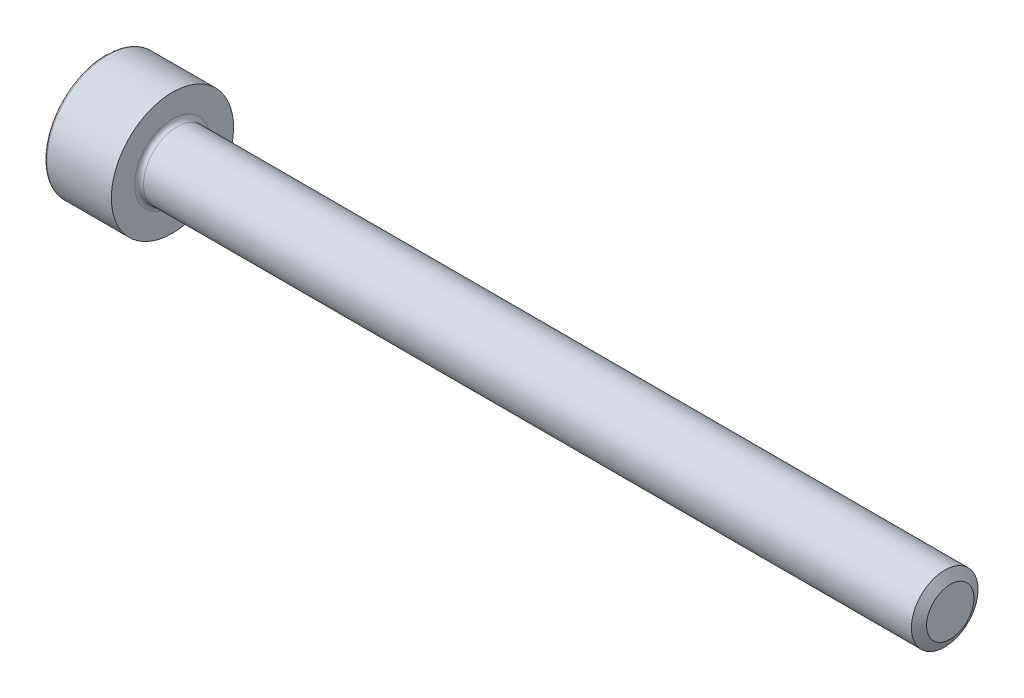
ISO-10303-21;
HEADER;
FILE_DESCRIPTION(('STEP AP214'),'2;1');
FILE_NAME('part.step','',(''),(''),'','','');
FILE_SCHEMA(('AUTOMOTIVE_DESIGN { 1 0 10303 214 1 1 1 1 }'));
ENDSEC;
DATA;
#1=APPLICATION_CONTEXT('core data for automotive mechanical design processes');
#2=APPLICATION_PROTOCOL_DEFINITION('international standard','automotive_design',2000,#1);
#3=PRODUCT_CONTEXT('',#1,'mechanical');
#4=PRODUCT('Part','Part','',(#3));
#5=PRODUCT_RELATED_PRODUCT_CATEGORY('part','',(#4));
#6=PRODUCT_DEFINITION_FORMATION('','',#4);
#7=PRODUCT_DEFINITION_CONTEXT('part definition',#1,'design');
#8=PRODUCT_DEFINITION('design','',#6,#7);
#9=PRODUCT_DEFINITION_SHAPE('','',#8);
#10=(LENGTH_UNIT() NAMED_UNIT(*) SI_UNIT(.MILLI.,.METRE.));
#11=(NAMED_UNIT(*) PLANE_ANGLE_UNIT() SI_UNIT($,.RADIAN.));
#12=(NAMED_UNIT(*) SI_UNIT($,.STERADIAN.) SOLID_ANGLE_UNIT());
#13=UNCERTAINTY_MEASURE_WITH_UNIT(LENGTH_MEASURE(1.E-05),#10,'distance_accuracy_value','');
#14=(GEOMETRIC_REPRESENTATION_CONTEXT(3) GLOBAL_UNCERTAINTY_ASSIGNED_CONTEXT((#13)) GLOBAL_UNIT_ASSIGNED_CONTEXT((#10,
#11,#12)) REPRESENTATION_CONTEXT('',''));
#15=CARTESIAN_POINT('',(0.,0.,0.));
#16=DIRECTION('',(0.,0.,1.));
#17=DIRECTION('',(1.,0.,0.));
#18=AXIS2_PLACEMENT_3D('',#15,#16,#17);
#19=CARTESIAN_POINT('',(0.,0.,0.));
#20=DIRECTION('',(-1.,0.,0.));
#21=DIRECTION('',(0.,0.,1.));
#22=AXIS2_PLACEMENT_3D('',#19,#20,#21);
#23=CYLINDRICAL_SURFACE('',#22,1.5);
#24=CARTESIAN_POINT('',(3.2,0.,0.));
#25=DIRECTION('',(-1.,0.,0.));
#26=DIRECTION('',(0.,0.,1.));
#27=AXIS2_PLACEMENT_3D('',#24,#25,#26);
#28=CIRCLE('',#27,1.5);
#29=CARTESIAN_POINT('',(3.2,0.,1.5));
#30=VERTEX_POINT('',#29);
#31=EDGE_CURVE('E150',#30,#30,#28,.T.);
#32=ORIENTED_EDGE('',*,*,#31,.F.);
#33=EDGE_LOOP('',(#32));
#34=FACE_BOUND('',#33,.T.);
#35=CARTESIAN_POINT('',(37.7500073334409,0.,0.));
#36=DIRECTION('',(-1.,0.,0.));
#37=DIRECTION('',(0.,0.,1.));
#38=AXIS2_PLACEMENT_3D('',#35,#36,#37);
#39=CIRCLE('',#38,1.5);
#40=CARTESIAN_POINT('',(37.7500073334409,0.,1.5));
#41=VERTEX_POINT('',#40);
#42=EDGE_CURVE('E287',#41,#41,#39,.T.);
#43=ORIENTED_EDGE('',*,*,#42,.T.);
#44=EDGE_LOOP('',(#43));
#45=FACE_BOUND('',#44,.T.);
#46=ADVANCED_FACE('F47',(#34,#45),#23,.T.);
#47=CARTESIAN_POINT('',(0.,0.,0.));
#48=DIRECTION('',(1.,0.,0.));
#49=DIRECTION('',(0.,0.,-1.));
#50=AXIS2_PLACEMENT_3D('',#47,#48,#49);
#51=PLANE('',#50);
#52=CARTESIAN_POINT('',(0.,0.,0.));
#53=DIRECTION('',(1.,0.,0.));
#54=DIRECTION('',(0.,0.,-1.));
#55=AXIS2_PLACEMENT_3D('',#52,#53,#54);
#56=CIRCLE('',#55,2.65);
#57=CARTESIAN_POINT('',(0.,0.,-2.65));
#58=VERTEX_POINT('',#57);
#59=EDGE_CURVE('E55',#58,#58,#56,.F.);
#60=ORIENTED_EDGE('',*,*,#59,.T.);
#61=EDGE_LOOP('',(#60));
#62=FACE_BOUND('',#61,.T.);
#63=DIRECTION('',(0.,0.866025403784439,-0.5));
#64=VECTOR('',#63,1.);
#65=CARTESIAN_POINT('',(0.,0.,1.435));
#66=LINE('',#65,#64);
#67=CARTESIAN_POINT('',(0.,0.,1.435));
#68=VERTEX_POINT('',#67);
#69=CARTESIAN_POINT('',(0.,1.24274645443067,0.717499999999999));
#70=VERTEX_POINT('',#69);
#71=EDGE_CURVE('E136',#68,#70,#66,.T.);
#72=ORIENTED_EDGE('',*,*,#71,.F.);
#73=DIRECTION('',(0.,0.866025403784439,0.5));
#74=VECTOR('',#73,1.);
#75=CARTESIAN_POINT('',(0.,-1.24274645443067,0.7175));
#76=LINE('',#75,#74);
#77=CARTESIAN_POINT('',(0.,-1.24274645443067,0.7175));
#78=VERTEX_POINT('',#77);
#79=EDGE_CURVE('E62',#78,#68,#76,.T.);
#80=ORIENTED_EDGE('',*,*,#79,.F.);
#81=DIRECTION('',(0.,0.,1.));
#82=VECTOR('',#81,1.);
#83=CARTESIAN_POINT('',(0.,-1.24274645443067,-0.7175));
#84=LINE('',#83,#82);
#85=CARTESIAN_POINT('',(0.,-1.24274645443067,-0.7175));
#86=VERTEX_POINT('',#85);
#87=EDGE_CURVE('E146',#86,#78,#84,.T.);
#88=ORIENTED_EDGE('',*,*,#87,.F.);
#89=DIRECTION('',(0.,-0.866025403784439,0.5));
#90=VECTOR('',#89,1.);
#91=CARTESIAN_POINT('',(0.,0.,-1.435));
#92=LINE('',#91,#90);
#93=CARTESIAN_POINT('',(0.,0.,-1.435));
#94=VERTEX_POINT('',#93);
#95=EDGE_CURVE('E144',#94,#86,#92,.T.);
#96=ORIENTED_EDGE('',*,*,#95,.F.);
#97=DIRECTION('',(0.,-0.866025403784439,-0.5));
#98=VECTOR('',#97,1.);
#99=CARTESIAN_POINT('',(0.,1.24274645443067,-0.7175));
#100=LINE('',#99,#98);
#101=CARTESIAN_POINT('',(0.,1.24274645443067,-0.7175));
#102=VERTEX_POINT('',#101);
#103=EDGE_CURVE('E110',#102,#94,#100,.T.);
#104=ORIENTED_EDGE('',*,*,#103,.F.);
#105=DIRECTION('',(0.,0.,-1.));
#106=VECTOR('',#105,1.);
#107=CARTESIAN_POINT('',(0.,1.24274645443067,0.717499999999999));
#108=LINE('',#107,#106);
#109=EDGE_CURVE('E140',#70,#102,#108,.T.);
#110=ORIENTED_EDGE('',*,*,#109,.F.);
#111=EDGE_LOOP('',(#72,#80,#88,#96,#104,#110));
#112=FACE_BOUND('',#111,.T.);
#113=ADVANCED_FACE('F167',(#62,#112),#51,.F.);
#114=CARTESIAN_POINT('',(0.,0.,0.));
#115=DIRECTION('',(-1.,0.,0.));
#116=DIRECTION('',(0.,0.,1.));
#117=AXIS2_PLACEMENT_3D('',#114,#115,#116);
#118=CYLINDRICAL_SURFACE('',#117,2.75);
#119=CARTESIAN_POINT('',(0.1,0.,0.));
#120=DIRECTION('',(1.,0.,0.));
#121=DIRECTION('',(0.,0.,-1.));
#122=AXIS2_PLACEMENT_3D('',#119,#120,#121);
#123=CIRCLE('',#122,2.75);
#124=CARTESIAN_POINT('',(0.1,0.,-2.75));
#125=VERTEX_POINT('',#124);
#126=EDGE_CURVE('E11',#125,#125,#123,.T.);
#127=ORIENTED_EDGE('',*,*,#126,.T.);
#128=EDGE_LOOP('',(#127));
#129=FACE_BOUND('',#128,.T.);
#130=CARTESIAN_POINT('',(3.,0.,0.));
#131=DIRECTION('',(-1.,0.,0.));
#132=DIRECTION('',(0.,0.,1.));
#133=AXIS2_PLACEMENT_3D('',#130,#131,#132);
#134=CIRCLE('',#133,2.75);
#135=CARTESIAN_POINT('',(3.,0.,2.75));
#136=VERTEX_POINT('',#135);
#137=EDGE_CURVE('E161',#136,#136,#134,.T.);
#138=ORIENTED_EDGE('',*,*,#137,.T.);
#139=EDGE_LOOP('',(#138));
#140=FACE_BOUND('',#139,.T.);
#141=ADVANCED_FACE('F186',(#129,#140),#118,.T.);
#142=CARTESIAN_POINT('',(3.,2.75,0.));
#143=DIRECTION('',(-1.,0.,0.));
#144=DIRECTION('',(0.,0.,1.));
#145=AXIS2_PLACEMENT_3D('',#142,#143,#144);
#146=PLANE('',#145);
#147=ORIENTED_EDGE('',*,*,#137,.F.);
#148=EDGE_LOOP('',(#147));
#149=FACE_BOUND('',#148,.T.);
#150=CARTESIAN_POINT('',(3.,0.,0.));
#151=DIRECTION('',(-1.,0.,0.));
#152=DIRECTION('',(0.,0.,1.));
#153=AXIS2_PLACEMENT_3D('',#150,#151,#152);
#154=CIRCLE('',#153,1.7);
#155=CARTESIAN_POINT('',(3.,0.,1.7));
#156=VERTEX_POINT('',#155);
#157=EDGE_CURVE('E158',#156,#156,#154,.T.);
#158=ORIENTED_EDGE('',*,*,#157,.T.);
#159=EDGE_LOOP('',(#158));
#160=FACE_BOUND('',#159,.T.);
#161=ADVANCED_FACE('F195',(#149,#160),#146,.F.);
#162=CARTESIAN_POINT('',(3.2,0.,0.));
#163=DIRECTION('',(-1.,0.,0.));
#164=DIRECTION('',(0.,0.,1.));
#165=AXIS2_PLACEMENT_3D('',#162,#163,#164);
#166=TOROIDAL_SURFACE('',#165,1.7,0.2);
#167=ORIENTED_EDGE('',*,*,#157,.F.);
#168=EDGE_LOOP('',(#167));
#169=FACE_BOUND('',#168,.T.);
#170=ORIENTED_EDGE('',*,*,#31,.T.);
#171=EDGE_LOOP('',(#170));
#172=FACE_BOUND('',#171,.T.);
#173=ADVANCED_FACE('F191',(#169,#172),#166,.F.);
#174=CARTESIAN_POINT('',(1.3,-1.24274645443067,0.7175));
#175=DIRECTION('',(0.,-0.5,0.866025403784439));
#176=DIRECTION('',(0.,-0.866025403784439,-0.5));
#177=AXIS2_PLACEMENT_3D('',#174,#175,#176);
#178=PLANE('',#177);
#179=ORIENTED_EDGE('',*,*,#79,.T.);
#180=DIRECTION('',(-1.,0.,0.));
#181=VECTOR('',#180,1.);
#182=CARTESIAN_POINT('',(1.3,0.,1.435));
#183=LINE('',#182,#181);
#184=CARTESIAN_POINT('',(1.3,0.,1.435));
#185=VERTEX_POINT('',#184);
#186=EDGE_CURVE('E92',#185,#68,#183,.T.);
#187=ORIENTED_EDGE('',*,*,#186,.F.);
#188=DIRECTION('',(0.,0.866025403784439,0.5));
#189=VECTOR('',#188,1.);
#190=CARTESIAN_POINT('',(1.3,-1.24274645443067,0.7175));
#191=LINE('',#190,#189);
#192=CARTESIAN_POINT('',(1.3,-1.24274645443067,0.7175));
#193=VERTEX_POINT('',#192);
#194=EDGE_CURVE('E148',#193,#185,#191,.T.);
#195=ORIENTED_EDGE('',*,*,#194,.F.);
#196=DIRECTION('',(-1.,0.,0.));
#197=VECTOR('',#196,1.);
#198=CARTESIAN_POINT('',(1.3,-1.24274645443067,0.7175));
#199=LINE('',#198,#197);
#200=EDGE_CURVE('E70',#193,#78,#199,.T.);
#201=ORIENTED_EDGE('',*,*,#200,.T.);
#202=EDGE_LOOP('',(#179,#187,#195,#201));
#203=FACE_BOUND('',#202,.T.);
#204=ADVANCED_FACE('F194',(#203),#178,.F.);
#205=CARTESIAN_POINT('',(1.3,-1.24274645443067,-0.7175));
#206=DIRECTION('',(0.,-1.,0.));
#207=DIRECTION('',(0.,0.,-1.));
#208=AXIS2_PLACEMENT_3D('',#205,#206,#207);
#209=PLANE('',#208);
#210=ORIENTED_EDGE('',*,*,#87,.T.);
#211=ORIENTED_EDGE('',*,*,#200,.F.);
#212=DIRECTION('',(0.,0.,1.));
#213=VECTOR('',#212,1.);
#214=CARTESIAN_POINT('',(1.3,-1.24274645443067,-0.7175));
#215=LINE('',#214,#213);
#216=CARTESIAN_POINT('',(1.3,-1.24274645443067,-0.7175));
#217=VERTEX_POINT('',#216);
#218=EDGE_CURVE('E122',#217,#193,#215,.T.);
#219=ORIENTED_EDGE('',*,*,#218,.F.);
#220=DIRECTION('',(-1.,0.,0.));
#221=VECTOR('',#220,1.);
#222=CARTESIAN_POINT('',(1.3,-1.24274645443067,-0.7175));
#223=LINE('',#222,#221);
#224=EDGE_CURVE('E114',#217,#86,#223,.T.);
#225=ORIENTED_EDGE('',*,*,#224,.T.);
#226=EDGE_LOOP('',(#210,#211,#219,#225));
#227=FACE_BOUND('',#226,.T.);
#228=ADVANCED_FACE('F225',(#227),#209,.F.);
#229=CARTESIAN_POINT('',(1.3,0.,-1.435));
#230=DIRECTION('',(0.,-0.5,-0.866025403784439));
#231=DIRECTION('',(0.,0.866025403784439,-0.5));
#232=AXIS2_PLACEMENT_3D('',#229,#230,#231);
#233=PLANE('',#232);
#234=ORIENTED_EDGE('',*,*,#95,.T.);
#235=ORIENTED_EDGE('',*,*,#224,.F.);
#236=DIRECTION('',(0.,-0.866025403784439,0.5));
#237=VECTOR('',#236,1.);
#238=CARTESIAN_POINT('',(1.3,0.,-1.435));
#239=LINE('',#238,#237);
#240=CARTESIAN_POINT('',(1.3,0.,-1.435));
#241=VERTEX_POINT('',#240);
#242=EDGE_CURVE('E118',#241,#217,#239,.T.);
#243=ORIENTED_EDGE('',*,*,#242,.F.);
#244=DIRECTION('',(-1.,0.,0.));
#245=VECTOR('',#244,1.);
#246=CARTESIAN_POINT('',(1.3,0.,-1.435));
#247=LINE('',#246,#245);
#248=EDGE_CURVE('E103',#241,#94,#247,.T.);
#249=ORIENTED_EDGE('',*,*,#248,.T.);
#250=EDGE_LOOP('',(#234,#235,#243,#249));
#251=FACE_BOUND('',#250,.T.);
#252=ADVANCED_FACE('F119',(#251),#233,.F.);
#253=CARTESIAN_POINT('',(1.3,1.24274645443067,-0.7175));
#254=DIRECTION('',(0.,0.5,-0.866025403784439));
#255=DIRECTION('',(0.,0.866025403784439,0.5));
#256=AXIS2_PLACEMENT_3D('',#253,#254,#255);
#257=PLANE('',#256);
#258=ORIENTED_EDGE('',*,*,#103,.T.);
#259=ORIENTED_EDGE('',*,*,#248,.F.);
#260=DIRECTION('',(0.,-0.866025403784439,-0.5));
#261=VECTOR('',#260,1.);
#262=CARTESIAN_POINT('',(1.3,1.24274645443067,-0.7175));
#263=LINE('',#262,#261);
#264=CARTESIAN_POINT('',(1.3,1.24274645443067,-0.7175));
#265=VERTEX_POINT('',#264);
#266=EDGE_CURVE('E107',#265,#241,#263,.T.);
#267=ORIENTED_EDGE('',*,*,#266,.F.);
#268=DIRECTION('',(-1.,0.,0.));
#269=VECTOR('',#268,1.);
#270=CARTESIAN_POINT('',(1.3,1.24274645443067,-0.7175));
#271=LINE('',#270,#269);
#272=EDGE_CURVE('E115',#265,#102,#271,.T.);
#273=ORIENTED_EDGE('',*,*,#272,.T.);
#274=EDGE_LOOP('',(#258,#259,#267,#273));
#275=FACE_BOUND('',#274,.T.);
#276=ADVANCED_FACE('F105',(#275),#257,.F.);
#277=CARTESIAN_POINT('',(1.3,1.24274645443067,0.717499999999999));
#278=DIRECTION('',(0.,1.,0.));
#279=DIRECTION('',(0.,0.,1.));
#280=AXIS2_PLACEMENT_3D('',#277,#278,#279);
#281=PLANE('',#280);
#282=ORIENTED_EDGE('',*,*,#109,.T.);
#283=ORIENTED_EDGE('',*,*,#272,.F.);
#284=DIRECTION('',(0.,0.,-1.));
#285=VECTOR('',#284,1.);
#286=CARTESIAN_POINT('',(1.3,1.24274645443067,0.717499999999999));
#287=LINE('',#286,#285);
#288=CARTESIAN_POINT('',(1.3,1.24274645443067,0.717499999999999));
#289=VERTEX_POINT('',#288);
#290=EDGE_CURVE('E128',#289,#265,#287,.T.);
#291=ORIENTED_EDGE('',*,*,#290,.F.);
#292=DIRECTION('',(-1.,0.,0.));
#293=VECTOR('',#292,1.);
#294=CARTESIAN_POINT('',(1.3,1.24274645443067,0.717499999999999));
#295=LINE('',#294,#293);
#296=EDGE_CURVE('E153',#289,#70,#295,.T.);
#297=ORIENTED_EDGE('',*,*,#296,.T.);
#298=EDGE_LOOP('',(#282,#283,#291,#297));
#299=FACE_BOUND('',#298,.T.);
#300=ADVANCED_FACE('F243',(#299),#281,.F.);
#301=CARTESIAN_POINT('',(1.3,0.,1.435));
#302=DIRECTION('',(0.,0.5,0.866025403784439));
#303=DIRECTION('',(0.,-0.866025403784439,0.5));
#304=AXIS2_PLACEMENT_3D('',#301,#302,#303);
#305=PLANE('',#304);
#306=ORIENTED_EDGE('',*,*,#71,.T.);
#307=ORIENTED_EDGE('',*,*,#296,.F.);
#308=DIRECTION('',(0.,0.866025403784439,-0.5));
#309=VECTOR('',#308,1.);
#310=CARTESIAN_POINT('',(1.3,0.,1.435));
#311=LINE('',#310,#309);
#312=EDGE_CURVE('E130',#185,#289,#311,.T.);
#313=ORIENTED_EDGE('',*,*,#312,.F.);
#314=ORIENTED_EDGE('',*,*,#186,.T.);
#315=EDGE_LOOP('',(#306,#307,#313,#314));
#316=FACE_BOUND('',#315,.T.);
#317=ADVANCED_FACE('F250',(#316),#305,.F.);
#318=CARTESIAN_POINT('',(1.3,-1.24274645443067,0.7175));
#319=DIRECTION('',(1.,0.,0.));
#320=DIRECTION('',(0.,0.,-1.));
#321=AXIS2_PLACEMENT_3D('',#318,#319,#320);
#322=PLANE('',#321);
#323=ORIENTED_EDGE('',*,*,#194,.T.);
#324=ORIENTED_EDGE('',*,*,#312,.T.);
#325=ORIENTED_EDGE('',*,*,#290,.T.);
#326=ORIENTED_EDGE('',*,*,#266,.T.);
#327=ORIENTED_EDGE('',*,*,#242,.T.);
#328=ORIENTED_EDGE('',*,*,#218,.T.);
#329=EDGE_LOOP('',(#323,#324,#325,#326,#327,#328));
#330=FACE_BOUND('',#329,.T.);
#331=ADVANCED_FACE('F125',(#330),#322,.F.);
#332=CARTESIAN_POINT('',(37.7500073334409,0.,0.));
#333=DIRECTION('',(-1.,0.,0.));
#334=DIRECTION('',(0.,0.,1.));
#335=AXIS2_PLACEMENT_3D('',#332,#333,#334);
#336=CONICAL_SURFACE('',#335,1.5,1.04719755119658);
#337=CARTESIAN_POINT('',(38.,0.,0.));
#338=DIRECTION('',(-1.,0.,0.));
#339=DIRECTION('',(0.,0.,1.));
#340=AXIS2_PLACEMENT_3D('',#337,#338,#339);
#341=CIRCLE('',#340,1.067);
#342=CARTESIAN_POINT('',(38.,0.,1.067));
#343=VERTEX_POINT('',#342);
#344=EDGE_CURVE('E137',#343,#343,#341,.T.);
#345=ORIENTED_EDGE('',*,*,#344,.T.);
#346=EDGE_LOOP('',(#345));
#347=FACE_BOUND('',#346,.T.);
#348=ORIENTED_EDGE('',*,*,#42,.F.);
#349=EDGE_LOOP('',(#348));
#350=FACE_BOUND('',#349,.T.);
#351=ADVANCED_FACE('F176',(#347,#350),#336,.T.);
#352=CARTESIAN_POINT('',(38.,1.5,0.));
#353=DIRECTION('',(-1.,0.,0.));
#354=DIRECTION('',(0.,0.,1.));
#355=AXIS2_PLACEMENT_3D('',#352,#353,#354);
#356=PLANE('',#355);
#357=ORIENTED_EDGE('',*,*,#344,.F.);
#358=EDGE_LOOP('',(#357));
#359=FACE_BOUND('',#358,.T.);
#360=ADVANCED_FACE('F171',(#359),#356,.F.);
#361=CARTESIAN_POINT('',(0.1,0.,0.));
#362=DIRECTION('',(1.,0.,0.));
#363=DIRECTION('',(0.,0.,-1.));
#364=AXIS2_PLACEMENT_3D('',#361,#362,#363);
#365=TOROIDAL_SURFACE('',#364,2.65,0.1);
#366=ORIENTED_EDGE('',*,*,#126,.F.);
#367=EDGE_LOOP('',(#366));
#368=FACE_BOUND('',#367,.T.);
#369=ORIENTED_EDGE('',*,*,#59,.F.);
#370=EDGE_LOOP('',(#369));
#371=FACE_BOUND('',#370,.T.);
#372=ADVANCED_FACE('F49',(#368,#371),#365,.T.);
#373=CLOSED_SHELL('',(#46,#113,#141,#161,#173,#204,#228,#252,#276,#300,#317,#331,#351,#360,#372));
#374=MANIFOLD_SOLID_BREP('B2',#373);
#375=ADVANCED_BREP_SHAPE_REPRESENTATION('',(#18,#374),#14);
#376=SHAPE_DEFINITION_REPRESENTATION(#9,#375);
ENDSEC;
END-ISO-10303-21;
